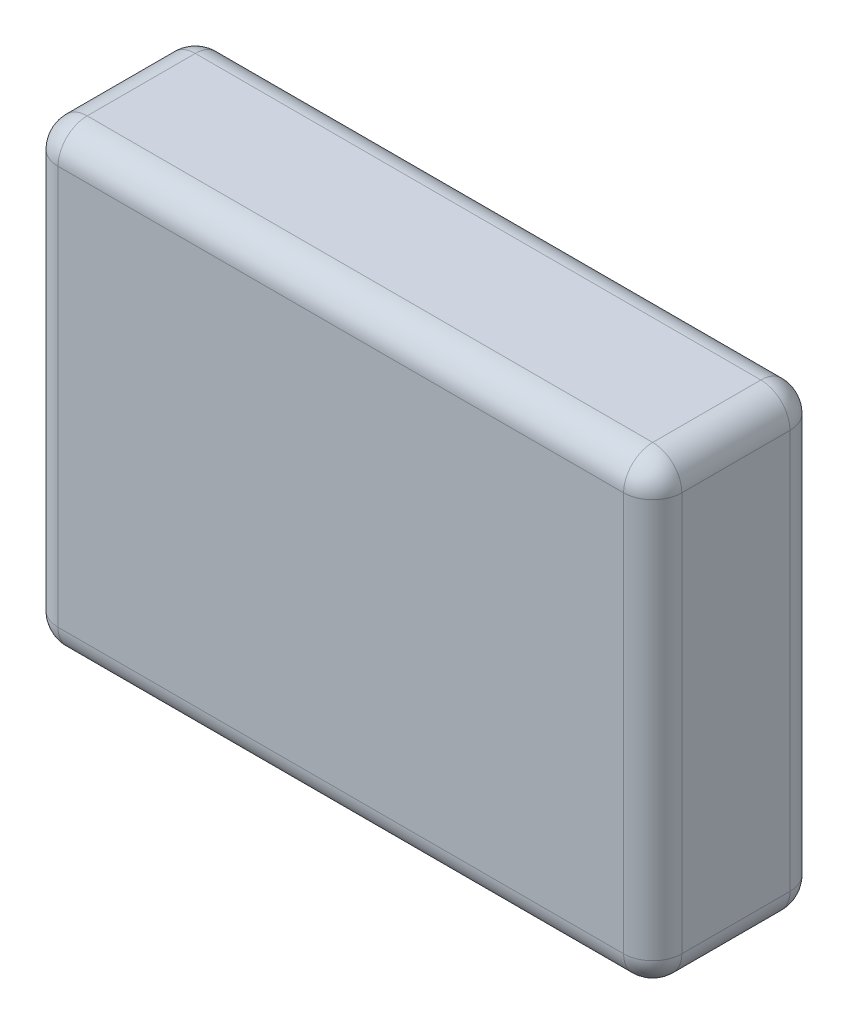
ISO-10303-21;
HEADER;
FILE_DESCRIPTION(('STEP AP214'),'2;1');
FILE_NAME('part.step','',(''),(''),'','','');
FILE_SCHEMA(('AUTOMOTIVE_DESIGN { 1 0 10303 214 1 1 1 1 }'));
ENDSEC;
DATA;
#1=APPLICATION_CONTEXT('core data for automotive mechanical design processes');
#2=APPLICATION_PROTOCOL_DEFINITION('international standard','automotive_design',2000,#1);
#3=PRODUCT_CONTEXT('',#1,'mechanical');
#4=PRODUCT('Part','Part','',(#3));
#5=PRODUCT_RELATED_PRODUCT_CATEGORY('part','',(#4));
#6=PRODUCT_DEFINITION_FORMATION('','',#4);
#7=PRODUCT_DEFINITION_CONTEXT('part definition',#1,'design');
#8=PRODUCT_DEFINITION('design','',#6,#7);
#9=PRODUCT_DEFINITION_SHAPE('','',#8);
#10=(LENGTH_UNIT() NAMED_UNIT(*) SI_UNIT(.MILLI.,.METRE.));
#11=(NAMED_UNIT(*) PLANE_ANGLE_UNIT() SI_UNIT($,.RADIAN.));
#12=(NAMED_UNIT(*) SI_UNIT($,.STERADIAN.) SOLID_ANGLE_UNIT());
#13=UNCERTAINTY_MEASURE_WITH_UNIT(LENGTH_MEASURE(1.E-05),#10,'distance_accuracy_value','');
#14=(GEOMETRIC_REPRESENTATION_CONTEXT(3) GLOBAL_UNCERTAINTY_ASSIGNED_CONTEXT((#13)) GLOBAL_UNIT_ASSIGNED_CONTEXT((#10,
#11,#12)) REPRESENTATION_CONTEXT('',''));
#15=CARTESIAN_POINT('',(0.,0.,0.));
#16=DIRECTION('',(0.,0.,1.));
#17=DIRECTION('',(1.,0.,0.));
#18=AXIS2_PLACEMENT_3D('',#15,#16,#17);
#19=CARTESIAN_POINT('',(0.,0.,200.));
#20=DIRECTION('',(1.,0.,0.));
#21=DIRECTION('',(0.,1.,0.));
#22=AXIS2_PLACEMENT_3D('',#19,#20,#21);
#23=PLANE('',#22);
#24=DIRECTION('',(0.,0.,-1.));
#25=VECTOR('',#24,1.);
#26=CARTESIAN_POINT('',(0.,35.,200.));
#27=LINE('',#26,#25);
#28=CARTESIAN_POINT('',(0.,35.,35.));
#29=VERTEX_POINT('',#28);
#30=CARTESIAN_POINT('',(0.,35.,165.));
#31=VERTEX_POINT('',#30);
#32=EDGE_CURVE('E131',#29,#31,#27,.F.);
#33=ORIENTED_EDGE('',*,*,#32,.T.);
#34=DIRECTION('',(0.,-1.,0.));
#35=VECTOR('',#34,1.);
#36=CARTESIAN_POINT('',(0.,0.,165.));
#37=LINE('',#36,#35);
#38=CARTESIAN_POINT('',(-2.07914493702529E-13,515.,165.));
#39=VERTEX_POINT('',#38);
#40=EDGE_CURVE('E168',#31,#39,#37,.F.);
#41=ORIENTED_EDGE('',*,*,#40,.T.);
#42=DIRECTION('',(0.,0.,-1.));
#43=VECTOR('',#42,1.);
#44=CARTESIAN_POINT('',(-2.07914493702529E-13,515.,200.));
#45=LINE('',#44,#43);
#46=CARTESIAN_POINT('',(-2.07914493702529E-13,515.,35.));
#47=VERTEX_POINT('',#46);
#48=EDGE_CURVE('E165',#39,#47,#45,.T.);
#49=ORIENTED_EDGE('',*,*,#48,.T.);
#50=DIRECTION('',(0.,-1.,0.));
#51=VECTOR('',#50,1.);
#52=CARTESIAN_POINT('',(0.,0.,35.));
#53=LINE('',#52,#51);
#54=EDGE_CURVE('E160',#47,#29,#53,.T.);
#55=ORIENTED_EDGE('',*,*,#54,.T.);
#56=EDGE_LOOP('',(#33,#41,#49,#55));
#57=FACE_BOUND('',#56,.T.);
#58=ADVANCED_FACE('F35',(#57),#23,.F.);
#59=CARTESIAN_POINT('',(0.,0.,200.));
#60=DIRECTION('',(0.,1.,0.));
#61=DIRECTION('',(0.,0.,1.));
#62=AXIS2_PLACEMENT_3D('',#59,#60,#61);
#63=PLANE('',#62);
#64=DIRECTION('',(0.,0.,-1.));
#65=VECTOR('',#64,1.);
#66=CARTESIAN_POINT('',(715.,0.,200.));
#67=LINE('',#66,#65);
#68=CARTESIAN_POINT('',(715.,0.,35.));
#69=VERTEX_POINT('',#68);
#70=CARTESIAN_POINT('',(715.,0.,165.));
#71=VERTEX_POINT('',#70);
#72=EDGE_CURVE('E153',#69,#71,#67,.F.);
#73=ORIENTED_EDGE('',*,*,#72,.T.);
#74=DIRECTION('',(1.,0.,0.));
#75=VECTOR('',#74,1.);
#76=CARTESIAN_POINT('',(0.,0.,165.));
#77=LINE('',#76,#75);
#78=CARTESIAN_POINT('',(35.,0.,165.));
#79=VERTEX_POINT('',#78);
#80=EDGE_CURVE('E157',#71,#79,#77,.F.);
#81=ORIENTED_EDGE('',*,*,#80,.T.);
#82=DIRECTION('',(0.,0.,-1.));
#83=VECTOR('',#82,1.);
#84=CARTESIAN_POINT('',(35.,0.,200.));
#85=LINE('',#84,#83);
#86=CARTESIAN_POINT('',(35.,0.,35.));
#87=VERTEX_POINT('',#86);
#88=EDGE_CURVE('E129',#79,#87,#85,.T.);
#89=ORIENTED_EDGE('',*,*,#88,.T.);
#90=DIRECTION('',(1.,0.,0.));
#91=VECTOR('',#90,1.);
#92=CARTESIAN_POINT('',(750.,0.,35.));
#93=LINE('',#92,#91);
#94=EDGE_CURVE('E147',#87,#69,#93,.T.);
#95=ORIENTED_EDGE('',*,*,#94,.T.);
#96=EDGE_LOOP('',(#73,#81,#89,#95));
#97=FACE_BOUND('',#96,.T.);
#98=ADVANCED_FACE('F155',(#97),#63,.F.);
#99=CARTESIAN_POINT('',(750.,0.,200.));
#100=DIRECTION('',(-1.,0.,0.));
#101=DIRECTION('',(0.,-1.,0.));
#102=AXIS2_PLACEMENT_3D('',#99,#100,#101);
#103=PLANE('',#102);
#104=DIRECTION('',(0.,0.,-1.));
#105=VECTOR('',#104,1.);
#106=CARTESIAN_POINT('',(750.,515.,200.));
#107=LINE('',#106,#105);
#108=CARTESIAN_POINT('',(750.,515.,35.));
#109=VERTEX_POINT('',#108);
#110=CARTESIAN_POINT('',(750.,515.,165.));
#111=VERTEX_POINT('',#110);
#112=EDGE_CURVE('E172',#109,#111,#107,.F.);
#113=ORIENTED_EDGE('',*,*,#112,.T.);
#114=DIRECTION('',(0.,1.,0.));
#115=VECTOR('',#114,1.);
#116=CARTESIAN_POINT('',(750.,0.,165.));
#117=LINE('',#116,#115);
#118=CARTESIAN_POINT('',(750.,35.,165.));
#119=VERTEX_POINT('',#118);
#120=EDGE_CURVE('E177',#111,#119,#117,.F.);
#121=ORIENTED_EDGE('',*,*,#120,.T.);
#122=DIRECTION('',(0.,0.,-1.));
#123=VECTOR('',#122,1.);
#124=CARTESIAN_POINT('',(750.,35.,200.));
#125=LINE('',#124,#123);
#126=CARTESIAN_POINT('',(750.,35.,35.));
#127=VERTEX_POINT('',#126);
#128=EDGE_CURVE('E174',#119,#127,#125,.T.);
#129=ORIENTED_EDGE('',*,*,#128,.T.);
#130=DIRECTION('',(0.,1.,0.));
#131=VECTOR('',#130,1.);
#132=CARTESIAN_POINT('',(750.,550.,35.));
#133=LINE('',#132,#131);
#134=EDGE_CURVE('E170',#127,#109,#133,.T.);
#135=ORIENTED_EDGE('',*,*,#134,.T.);
#136=EDGE_LOOP('',(#113,#121,#129,#135));
#137=FACE_BOUND('',#136,.T.);
#138=ADVANCED_FACE('F282',(#137),#103,.F.);
#139=CARTESIAN_POINT('',(-2.22044604925031E-13,550.,200.));
#140=DIRECTION('',(0.,-1.,0.));
#141=DIRECTION('',(0.,0.,-1.));
#142=AXIS2_PLACEMENT_3D('',#139,#140,#141);
#143=PLANE('',#142);
#144=DIRECTION('',(0.,0.,-1.));
#145=VECTOR('',#144,1.);
#146=CARTESIAN_POINT('',(34.9999999999998,550.,200.));
#147=LINE('',#146,#145);
#148=CARTESIAN_POINT('',(34.9999999999998,550.,35.));
#149=VERTEX_POINT('',#148);
#150=CARTESIAN_POINT('',(34.9999999999998,550.,165.));
#151=VERTEX_POINT('',#150);
#152=EDGE_CURVE('E181',#149,#151,#147,.F.);
#153=ORIENTED_EDGE('',*,*,#152,.T.);
#154=DIRECTION('',(-1.,0.,0.));
#155=VECTOR('',#154,1.);
#156=CARTESIAN_POINT('',(-2.22044604925031E-13,550.,165.));
#157=LINE('',#156,#155);
#158=CARTESIAN_POINT('',(715.,550.,165.));
#159=VERTEX_POINT('',#158);
#160=EDGE_CURVE('E186',#151,#159,#157,.F.);
#161=ORIENTED_EDGE('',*,*,#160,.T.);
#162=DIRECTION('',(0.,0.,-1.));
#163=VECTOR('',#162,1.);
#164=CARTESIAN_POINT('',(715.,550.,200.));
#165=LINE('',#164,#163);
#166=CARTESIAN_POINT('',(715.,550.,35.));
#167=VERTEX_POINT('',#166);
#168=EDGE_CURVE('E183',#159,#167,#165,.T.);
#169=ORIENTED_EDGE('',*,*,#168,.T.);
#170=DIRECTION('',(-1.,0.,0.));
#171=VECTOR('',#170,1.);
#172=CARTESIAN_POINT('',(-2.22044604925031E-13,550.,35.));
#173=LINE('',#172,#171);
#174=EDGE_CURVE('E179',#167,#149,#173,.T.);
#175=ORIENTED_EDGE('',*,*,#174,.T.);
#176=EDGE_LOOP('',(#153,#161,#169,#175));
#177=FACE_BOUND('',#176,.T.);
#178=ADVANCED_FACE('F293',(#177),#143,.F.);
#179=CARTESIAN_POINT('',(0.,0.,200.));
#180=DIRECTION('',(0.,0.,-1.));
#181=DIRECTION('',(-1.,0.,0.));
#182=AXIS2_PLACEMENT_3D('',#179,#180,#181);
#183=PLANE('',#182);
#184=DIRECTION('',(0.,1.,0.));
#185=VECTOR('',#184,1.);
#186=CARTESIAN_POINT('',(715.,2.88657986402541E-13,200.));
#187=LINE('',#186,#185);
#188=CARTESIAN_POINT('',(715.,35.,200.));
#189=VERTEX_POINT('',#188);
#190=CARTESIAN_POINT('',(715.,515.,200.));
#191=VERTEX_POINT('',#190);
#192=EDGE_CURVE('E192',#189,#191,#187,.T.);
#193=ORIENTED_EDGE('',*,*,#192,.T.);
#194=DIRECTION('',(-1.,0.,0.));
#195=VECTOR('',#194,1.);
#196=CARTESIAN_POINT('',(0.,515.,200.));
#197=LINE('',#196,#195);
#198=CARTESIAN_POINT('',(34.9999999999998,515.,200.));
#199=VERTEX_POINT('',#198);
#200=EDGE_CURVE('E194',#191,#199,#197,.T.);
#201=ORIENTED_EDGE('',*,*,#200,.T.);
#202=DIRECTION('',(0.,-1.,0.));
#203=VECTOR('',#202,1.);
#204=CARTESIAN_POINT('',(35.,0.,200.));
#205=LINE('',#204,#203);
#206=CARTESIAN_POINT('',(35.,35.,200.));
#207=VERTEX_POINT('',#206);
#208=EDGE_CURVE('E188',#199,#207,#205,.T.);
#209=ORIENTED_EDGE('',*,*,#208,.T.);
#210=DIRECTION('',(1.,0.,0.));
#211=VECTOR('',#210,1.);
#212=CARTESIAN_POINT('',(0.,35.,200.));
#213=LINE('',#212,#211);
#214=EDGE_CURVE('E190',#207,#189,#213,.T.);
#215=ORIENTED_EDGE('',*,*,#214,.T.);
#216=EDGE_LOOP('',(#193,#201,#209,#215));
#217=FACE_BOUND('',#216,.T.);
#218=ADVANCED_FACE('F274',(#217),#183,.F.);
#219=CARTESIAN_POINT('',(0.,0.,0.));
#220=DIRECTION('',(0.,0.,-1.));
#221=DIRECTION('',(-1.,0.,0.));
#222=AXIS2_PLACEMENT_3D('',#219,#220,#221);
#223=PLANE('',#222);
#224=DIRECTION('',(0.,1.,0.));
#225=VECTOR('',#224,1.);
#226=CARTESIAN_POINT('',(715.,0.,0.));
#227=LINE('',#226,#225);
#228=CARTESIAN_POINT('',(715.,515.,0.));
#229=VERTEX_POINT('',#228);
#230=CARTESIAN_POINT('',(715.,35.,0.));
#231=VERTEX_POINT('',#230);
#232=EDGE_CURVE('E44',#229,#231,#227,.F.);
#233=ORIENTED_EDGE('',*,*,#232,.T.);
#234=DIRECTION('',(1.,0.,0.));
#235=VECTOR('',#234,1.);
#236=CARTESIAN_POINT('',(0.,35.,0.));
#237=LINE('',#236,#235);
#238=CARTESIAN_POINT('',(35.,35.,0.));
#239=VERTEX_POINT('',#238);
#240=EDGE_CURVE('E11',#231,#239,#237,.F.);
#241=ORIENTED_EDGE('',*,*,#240,.T.);
#242=DIRECTION('',(0.,-1.,0.));
#243=VECTOR('',#242,1.);
#244=CARTESIAN_POINT('',(34.9999999999998,550.,0.));
#245=LINE('',#244,#243);
#246=CARTESIAN_POINT('',(34.9999999999998,515.,0.));
#247=VERTEX_POINT('',#246);
#248=EDGE_CURVE('E197',#239,#247,#245,.F.);
#249=ORIENTED_EDGE('',*,*,#248,.T.);
#250=DIRECTION('',(-1.,0.,0.));
#251=VECTOR('',#250,1.);
#252=CARTESIAN_POINT('',(750.,515.,0.));
#253=LINE('',#252,#251);
#254=EDGE_CURVE('E55',#247,#229,#253,.F.);
#255=ORIENTED_EDGE('',*,*,#254,.T.);
#256=EDGE_LOOP('',(#233,#241,#249,#255));
#257=FACE_BOUND('',#256,.T.);
#258=ADVANCED_FACE('F480',(#257),#223,.T.);
#259=CARTESIAN_POINT('',(715.,515.,200.));
#260=DIRECTION('',(0.,0.,-1.));
#261=DIRECTION('',(-1.,0.,0.));
#262=AXIS2_PLACEMENT_3D('',#259,#260,#261);
#263=CYLINDRICAL_SURFACE('',#262,35.);
#264=CARTESIAN_POINT('',(715.,515.,165.));
#265=DIRECTION('',(0.,0.,1.));
#266=DIRECTION('',(1.,0.,0.));
#267=AXIS2_PLACEMENT_3D('',#264,#265,#266);
#268=CIRCLE('',#267,35.);
#269=EDGE_CURVE('E39',#111,#159,#268,.T.);
#270=ORIENTED_EDGE('',*,*,#269,.F.);
#271=ORIENTED_EDGE('',*,*,#112,.F.);
#272=CARTESIAN_POINT('',(715.,515.,35.));
#273=DIRECTION('',(0.,0.,-1.));
#274=DIRECTION('',(-1.,0.,0.));
#275=AXIS2_PLACEMENT_3D('',#272,#273,#274);
#276=CIRCLE('',#275,35.);
#277=EDGE_CURVE('E251',#167,#109,#276,.T.);
#278=ORIENTED_EDGE('',*,*,#277,.F.);
#279=ORIENTED_EDGE('',*,*,#168,.F.);
#280=EDGE_LOOP('',(#270,#271,#278,#279));
#281=FACE_BOUND('',#280,.T.);
#282=ADVANCED_FACE('F37',(#281),#263,.T.);
#283=CARTESIAN_POINT('',(715.,515.,165.));
#284=DIRECTION('',(0.,0.,1.));
#285=DIRECTION('',(1.,0.,0.));
#286=AXIS2_PLACEMENT_3D('',#283,#284,#285);
#287=SPHERICAL_SURFACE('',#286,35.);
#288=CARTESIAN_POINT('',(715.,515.,165.));
#289=DIRECTION('',(0.,1.,0.));
#290=DIRECTION('',(0.,0.,1.));
#291=AXIS2_PLACEMENT_3D('',#288,#289,#290);
#292=CIRCLE('',#291,35.);
#293=EDGE_CURVE('E246',#111,#191,#292,.F.);
#294=ORIENTED_EDGE('',*,*,#293,.F.);
#295=ORIENTED_EDGE('',*,*,#269,.T.);
#296=CARTESIAN_POINT('',(715.,515.,165.));
#297=DIRECTION('',(1.,0.,0.));
#298=DIRECTION('',(0.,0.,-1.));
#299=AXIS2_PLACEMENT_3D('',#296,#297,#298);
#300=CIRCLE('',#299,35.);
#301=EDGE_CURVE('E249',#191,#159,#300,.F.);
#302=ORIENTED_EDGE('',*,*,#301,.F.);
#303=EDGE_LOOP('',(#294,#295,#302));
#304=FACE_BOUND('',#303,.T.);
#305=ADVANCED_FACE('F262',(#304),#287,.T.);
#306=CARTESIAN_POINT('',(715.,515.,35.));
#307=DIRECTION('',(0.,0.,1.));
#308=DIRECTION('',(1.,0.,0.));
#309=AXIS2_PLACEMENT_3D('',#306,#307,#308);
#310=SPHERICAL_SURFACE('',#309,35.);
#311=CARTESIAN_POINT('',(715.,515.,35.));
#312=DIRECTION('',(1.,0.,0.));
#313=DIRECTION('',(0.,0.,-1.));
#314=AXIS2_PLACEMENT_3D('',#311,#312,#313);
#315=CIRCLE('',#314,35.);
#316=EDGE_CURVE('E241',#167,#229,#315,.F.);
#317=ORIENTED_EDGE('',*,*,#316,.F.);
#318=ORIENTED_EDGE('',*,*,#277,.T.);
#319=CARTESIAN_POINT('',(715.,515.,35.));
#320=DIRECTION('',(0.,1.,0.));
#321=DIRECTION('',(0.,0.,1.));
#322=AXIS2_PLACEMENT_3D('',#319,#320,#321);
#323=CIRCLE('',#322,35.);
#324=EDGE_CURVE('E243',#229,#109,#323,.F.);
#325=ORIENTED_EDGE('',*,*,#324,.F.);
#326=EDGE_LOOP('',(#317,#318,#325));
#327=FACE_BOUND('',#326,.T.);
#328=ADVANCED_FACE('F459',(#327),#310,.T.);
#329=CARTESIAN_POINT('',(0.,515.,165.));
#330=DIRECTION('',(-1.,0.,0.));
#331=DIRECTION('',(0.,0.,1.));
#332=AXIS2_PLACEMENT_3D('',#329,#330,#331);
#333=CYLINDRICAL_SURFACE('',#332,35.);
#334=ORIENTED_EDGE('',*,*,#301,.T.);
#335=ORIENTED_EDGE('',*,*,#160,.F.);
#336=CARTESIAN_POINT('',(34.9999999999998,515.,165.));
#337=DIRECTION('',(-1.,0.,0.));
#338=DIRECTION('',(0.,0.,1.));
#339=AXIS2_PLACEMENT_3D('',#336,#337,#338);
#340=CIRCLE('',#339,35.);
#341=EDGE_CURVE('E235',#199,#151,#340,.T.);
#342=ORIENTED_EDGE('',*,*,#341,.F.);
#343=ORIENTED_EDGE('',*,*,#200,.F.);
#344=EDGE_LOOP('',(#334,#335,#342,#343));
#345=FACE_BOUND('',#344,.T.);
#346=ADVANCED_FACE('F270',(#345),#333,.T.);
#347=CARTESIAN_POINT('',(715.,2.88657986402541E-13,165.));
#348=DIRECTION('',(0.,1.,0.));
#349=DIRECTION('',(-1.,0.,0.));
#350=AXIS2_PLACEMENT_3D('',#347,#348,#349);
#351=CYLINDRICAL_SURFACE('',#350,35.);
#352=ORIENTED_EDGE('',*,*,#293,.T.);
#353=ORIENTED_EDGE('',*,*,#192,.F.);
#354=CARTESIAN_POINT('',(715.,35.,165.));
#355=DIRECTION('',(0.,-1.,0.));
#356=DIRECTION('',(1.,0.,0.));
#357=AXIS2_PLACEMENT_3D('',#354,#355,#356);
#358=CIRCLE('',#357,35.);
#359=EDGE_CURVE('E232',#119,#189,#358,.T.);
#360=ORIENTED_EDGE('',*,*,#359,.F.);
#361=ORIENTED_EDGE('',*,*,#120,.F.);
#362=EDGE_LOOP('',(#352,#353,#360,#361));
#363=FACE_BOUND('',#362,.T.);
#364=ADVANCED_FACE('F279',(#363),#351,.T.);
#365=CARTESIAN_POINT('',(715.,35.,200.));
#366=DIRECTION('',(0.,0.,-1.));
#367=DIRECTION('',(-1.,0.,0.));
#368=AXIS2_PLACEMENT_3D('',#365,#366,#367);
#369=CYLINDRICAL_SURFACE('',#368,35.);
#370=CARTESIAN_POINT('',(715.,35.,35.));
#371=DIRECTION('',(0.,0.,-1.));
#372=DIRECTION('',(-1.,0.,0.));
#373=AXIS2_PLACEMENT_3D('',#370,#371,#372);
#374=CIRCLE('',#373,35.);
#375=EDGE_CURVE('E226',#127,#69,#374,.T.);
#376=ORIENTED_EDGE('',*,*,#375,.F.);
#377=ORIENTED_EDGE('',*,*,#128,.F.);
#378=CARTESIAN_POINT('',(715.,35.,165.));
#379=DIRECTION('',(0.,0.,1.));
#380=DIRECTION('',(1.,0.,0.));
#381=AXIS2_PLACEMENT_3D('',#378,#379,#380);
#382=CIRCLE('',#381,35.);
#383=EDGE_CURVE('E229',#71,#119,#382,.T.);
#384=ORIENTED_EDGE('',*,*,#383,.F.);
#385=ORIENTED_EDGE('',*,*,#72,.F.);
#386=EDGE_LOOP('',(#376,#377,#384,#385));
#387=FACE_BOUND('',#386,.T.);
#388=ADVANCED_FACE('F286',(#387),#369,.T.);
#389=CARTESIAN_POINT('',(715.,0.,35.));
#390=DIRECTION('',(0.,-1.,0.));
#391=DIRECTION('',(1.,0.,0.));
#392=AXIS2_PLACEMENT_3D('',#389,#390,#391);
#393=CYLINDRICAL_SURFACE('',#392,35.);
#394=ORIENTED_EDGE('',*,*,#324,.T.);
#395=ORIENTED_EDGE('',*,*,#134,.F.);
#396=CARTESIAN_POINT('',(715.,35.,35.));
#397=DIRECTION('',(0.,-1.,0.));
#398=DIRECTION('',(1.,0.,0.));
#399=AXIS2_PLACEMENT_3D('',#396,#397,#398);
#400=CIRCLE('',#399,35.);
#401=EDGE_CURVE('E224',#231,#127,#400,.T.);
#402=ORIENTED_EDGE('',*,*,#401,.F.);
#403=ORIENTED_EDGE('',*,*,#232,.F.);
#404=EDGE_LOOP('',(#394,#395,#402,#403));
#405=FACE_BOUND('',#404,.T.);
#406=ADVANCED_FACE('F291',(#405),#393,.T.);
#407=CARTESIAN_POINT('',(-2.22044604925031E-13,515.,35.));
#408=DIRECTION('',(1.,0.,0.));
#409=DIRECTION('',(0.,0.,-1.));
#410=AXIS2_PLACEMENT_3D('',#407,#408,#409);
#411=CYLINDRICAL_SURFACE('',#410,35.);
#412=ORIENTED_EDGE('',*,*,#316,.T.);
#413=ORIENTED_EDGE('',*,*,#254,.F.);
#414=CARTESIAN_POINT('',(34.9999999999998,515.,35.));
#415=DIRECTION('',(-1.,0.,0.));
#416=DIRECTION('',(0.,0.,1.));
#417=AXIS2_PLACEMENT_3D('',#414,#415,#416);
#418=CIRCLE('',#417,35.);
#419=EDGE_CURVE('E221',#149,#247,#418,.T.);
#420=ORIENTED_EDGE('',*,*,#419,.F.);
#421=ORIENTED_EDGE('',*,*,#174,.F.);
#422=EDGE_LOOP('',(#412,#413,#420,#421));
#423=FACE_BOUND('',#422,.T.);
#424=ADVANCED_FACE('F302',(#423),#411,.T.);
#425=CARTESIAN_POINT('',(34.9999999999998,515.,200.));
#426=DIRECTION('',(0.,0.,-1.));
#427=DIRECTION('',(-1.,0.,0.));
#428=AXIS2_PLACEMENT_3D('',#425,#426,#427);
#429=CYLINDRICAL_SURFACE('',#428,35.);
#430=CARTESIAN_POINT('',(34.9999999999998,515.,165.));
#431=DIRECTION('',(0.,0.,1.));
#432=DIRECTION('',(1.,0.,0.));
#433=AXIS2_PLACEMENT_3D('',#430,#431,#432);
#434=CIRCLE('',#433,35.);
#435=EDGE_CURVE('E238',#151,#39,#434,.T.);
#436=ORIENTED_EDGE('',*,*,#435,.F.);
#437=ORIENTED_EDGE('',*,*,#152,.F.);
#438=CARTESIAN_POINT('',(34.9999999999998,515.,35.));
#439=DIRECTION('',(0.,0.,-1.));
#440=DIRECTION('',(-1.,0.,0.));
#441=AXIS2_PLACEMENT_3D('',#438,#439,#440);
#442=CIRCLE('',#441,35.);
#443=EDGE_CURVE('E218',#47,#149,#442,.T.);
#444=ORIENTED_EDGE('',*,*,#443,.F.);
#445=ORIENTED_EDGE('',*,*,#48,.F.);
#446=EDGE_LOOP('',(#436,#437,#444,#445));
#447=FACE_BOUND('',#446,.T.);
#448=ADVANCED_FACE('F298',(#447),#429,.T.);
#449=CARTESIAN_POINT('',(34.9999999999998,515.,165.));
#450=DIRECTION('',(0.,0.,1.));
#451=DIRECTION('',(1.,0.,0.));
#452=AXIS2_PLACEMENT_3D('',#449,#450,#451);
#453=SPHERICAL_SURFACE('',#452,35.);
#454=ORIENTED_EDGE('',*,*,#341,.T.);
#455=ORIENTED_EDGE('',*,*,#435,.T.);
#456=CARTESIAN_POINT('',(34.9999999999998,515.,165.));
#457=DIRECTION('',(0.,1.,0.));
#458=DIRECTION('',(0.,0.,1.));
#459=AXIS2_PLACEMENT_3D('',#456,#457,#458);
#460=CIRCLE('',#459,35.);
#461=EDGE_CURVE('E215',#199,#39,#460,.F.);
#462=ORIENTED_EDGE('',*,*,#461,.F.);
#463=EDGE_LOOP('',(#454,#455,#462));
#464=FACE_BOUND('',#463,.T.);
#465=ADVANCED_FACE('F312',(#464),#453,.T.);
#466=CARTESIAN_POINT('',(715.,35.,165.));
#467=DIRECTION('',(0.,0.,1.));
#468=DIRECTION('',(1.,0.,0.));
#469=AXIS2_PLACEMENT_3D('',#466,#467,#468);
#470=SPHERICAL_SURFACE('',#469,35.);
#471=ORIENTED_EDGE('',*,*,#383,.T.);
#472=ORIENTED_EDGE('',*,*,#359,.T.);
#473=CARTESIAN_POINT('',(715.,35.,165.));
#474=DIRECTION('',(1.,0.,0.));
#475=DIRECTION('',(0.,0.,-1.));
#476=AXIS2_PLACEMENT_3D('',#473,#474,#475);
#477=CIRCLE('',#476,35.);
#478=EDGE_CURVE('E212',#71,#189,#477,.F.);
#479=ORIENTED_EDGE('',*,*,#478,.F.);
#480=EDGE_LOOP('',(#471,#472,#479));
#481=FACE_BOUND('',#480,.T.);
#482=ADVANCED_FACE('F322',(#481),#470,.T.);
#483=CARTESIAN_POINT('',(715.,35.,35.));
#484=DIRECTION('',(0.,0.,1.));
#485=DIRECTION('',(1.,0.,0.));
#486=AXIS2_PLACEMENT_3D('',#483,#484,#485);
#487=SPHERICAL_SURFACE('',#486,35.);
#488=ORIENTED_EDGE('',*,*,#401,.T.);
#489=ORIENTED_EDGE('',*,*,#375,.T.);
#490=CARTESIAN_POINT('',(715.,35.,35.));
#491=DIRECTION('',(1.,0.,0.));
#492=DIRECTION('',(0.,0.,-1.));
#493=AXIS2_PLACEMENT_3D('',#490,#491,#492);
#494=CIRCLE('',#493,35.);
#495=EDGE_CURVE('E150',#231,#69,#494,.F.);
#496=ORIENTED_EDGE('',*,*,#495,.F.);
#497=EDGE_LOOP('',(#488,#489,#496));
#498=FACE_BOUND('',#497,.T.);
#499=ADVANCED_FACE('F324',(#498),#487,.T.);
#500=CARTESIAN_POINT('',(34.9999999999998,515.,35.));
#501=DIRECTION('',(0.,0.,1.));
#502=DIRECTION('',(1.,0.,0.));
#503=AXIS2_PLACEMENT_3D('',#500,#501,#502);
#504=SPHERICAL_SURFACE('',#503,35.);
#505=ORIENTED_EDGE('',*,*,#443,.T.);
#506=ORIENTED_EDGE('',*,*,#419,.T.);
#507=CARTESIAN_POINT('',(34.9999999999998,515.,35.));
#508=DIRECTION('',(0.,1.,0.));
#509=DIRECTION('',(0.,0.,1.));
#510=AXIS2_PLACEMENT_3D('',#507,#508,#509);
#511=CIRCLE('',#510,35.);
#512=EDGE_CURVE('E208',#47,#247,#511,.F.);
#513=ORIENTED_EDGE('',*,*,#512,.F.);
#514=EDGE_LOOP('',(#505,#506,#513));
#515=FACE_BOUND('',#514,.T.);
#516=ADVANCED_FACE('F304',(#515),#504,.T.);
#517=CARTESIAN_POINT('',(35.,0.,165.));
#518=DIRECTION('',(0.,-1.,0.));
#519=DIRECTION('',(1.,0.,0.));
#520=AXIS2_PLACEMENT_3D('',#517,#518,#519);
#521=CYLINDRICAL_SURFACE('',#520,35.);
#522=ORIENTED_EDGE('',*,*,#461,.T.);
#523=ORIENTED_EDGE('',*,*,#40,.F.);
#524=CARTESIAN_POINT('',(35.,35.,165.));
#525=DIRECTION('',(0.,-1.,0.));
#526=DIRECTION('',(1.,0.,0.));
#527=AXIS2_PLACEMENT_3D('',#524,#525,#526);
#528=CIRCLE('',#527,35.);
#529=EDGE_CURVE('E205',#207,#31,#528,.T.);
#530=ORIENTED_EDGE('',*,*,#529,.F.);
#531=ORIENTED_EDGE('',*,*,#208,.F.);
#532=EDGE_LOOP('',(#522,#523,#530,#531));
#533=FACE_BOUND('',#532,.T.);
#534=ADVANCED_FACE('F314',(#533),#521,.T.);
#535=CARTESIAN_POINT('',(0.,35.,165.));
#536=DIRECTION('',(1.,0.,0.));
#537=DIRECTION('',(0.,0.,-1.));
#538=AXIS2_PLACEMENT_3D('',#535,#536,#537);
#539=CYLINDRICAL_SURFACE('',#538,35.);
#540=ORIENTED_EDGE('',*,*,#478,.T.);
#541=ORIENTED_EDGE('',*,*,#214,.F.);
#542=CARTESIAN_POINT('',(35.,35.,165.));
#543=DIRECTION('',(-1.,0.,0.));
#544=DIRECTION('',(0.,0.,1.));
#545=AXIS2_PLACEMENT_3D('',#542,#543,#544);
#546=CIRCLE('',#545,35.);
#547=EDGE_CURVE('E144',#79,#207,#546,.T.);
#548=ORIENTED_EDGE('',*,*,#547,.F.);
#549=ORIENTED_EDGE('',*,*,#80,.F.);
#550=EDGE_LOOP('',(#540,#541,#548,#549));
#551=FACE_BOUND('',#550,.T.);
#552=ADVANCED_FACE('F320',(#551),#539,.T.);
#553=CARTESIAN_POINT('',(0.,35.,35.));
#554=DIRECTION('',(-1.,0.,0.));
#555=DIRECTION('',(0.,0.,1.));
#556=AXIS2_PLACEMENT_3D('',#553,#554,#555);
#557=CYLINDRICAL_SURFACE('',#556,35.);
#558=ORIENTED_EDGE('',*,*,#495,.T.);
#559=ORIENTED_EDGE('',*,*,#94,.F.);
#560=CARTESIAN_POINT('',(35.,35.,35.));
#561=DIRECTION('',(-1.,0.,0.));
#562=DIRECTION('',(0.,0.,1.));
#563=AXIS2_PLACEMENT_3D('',#560,#561,#562);
#564=CIRCLE('',#563,35.);
#565=EDGE_CURVE('E136',#239,#87,#564,.T.);
#566=ORIENTED_EDGE('',*,*,#565,.F.);
#567=ORIENTED_EDGE('',*,*,#240,.F.);
#568=EDGE_LOOP('',(#558,#559,#566,#567));
#569=FACE_BOUND('',#568,.T.);
#570=ADVANCED_FACE('F148',(#569),#557,.T.);
#571=CARTESIAN_POINT('',(35.,0.,35.));
#572=DIRECTION('',(0.,1.,0.));
#573=DIRECTION('',(-1.,0.,0.));
#574=AXIS2_PLACEMENT_3D('',#571,#572,#573);
#575=CYLINDRICAL_SURFACE('',#574,35.);
#576=ORIENTED_EDGE('',*,*,#512,.T.);
#577=ORIENTED_EDGE('',*,*,#248,.F.);
#578=CARTESIAN_POINT('',(35.,35.,35.));
#579=DIRECTION('',(0.,-1.,0.));
#580=DIRECTION('',(1.,0.,0.));
#581=AXIS2_PLACEMENT_3D('',#578,#579,#580);
#582=CIRCLE('',#581,35.);
#583=EDGE_CURVE('E140',#29,#239,#582,.T.);
#584=ORIENTED_EDGE('',*,*,#583,.F.);
#585=ORIENTED_EDGE('',*,*,#54,.F.);
#586=EDGE_LOOP('',(#576,#577,#584,#585));
#587=FACE_BOUND('',#586,.T.);
#588=ADVANCED_FACE('F307',(#587),#575,.T.);
#589=CARTESIAN_POINT('',(35.,35.,165.));
#590=DIRECTION('',(0.,0.,1.));
#591=DIRECTION('',(1.,0.,0.));
#592=AXIS2_PLACEMENT_3D('',#589,#590,#591);
#593=SPHERICAL_SURFACE('',#592,35.);
#594=ORIENTED_EDGE('',*,*,#547,.T.);
#595=ORIENTED_EDGE('',*,*,#529,.T.);
#596=CARTESIAN_POINT('',(35.,35.,165.));
#597=DIRECTION('',(0.,0.,1.));
#598=DIRECTION('',(1.,0.,0.));
#599=AXIS2_PLACEMENT_3D('',#596,#597,#598);
#600=CIRCLE('',#599,35.);
#601=EDGE_CURVE('E133',#79,#31,#600,.F.);
#602=ORIENTED_EDGE('',*,*,#601,.F.);
#603=EDGE_LOOP('',(#594,#595,#602));
#604=FACE_BOUND('',#603,.T.);
#605=ADVANCED_FACE('F318',(#604),#593,.T.);
#606=CARTESIAN_POINT('',(35.,35.,35.));
#607=DIRECTION('',(0.,0.,1.));
#608=DIRECTION('',(1.,0.,0.));
#609=AXIS2_PLACEMENT_3D('',#606,#607,#608);
#610=SPHERICAL_SURFACE('',#609,35.);
#611=ORIENTED_EDGE('',*,*,#583,.T.);
#612=ORIENTED_EDGE('',*,*,#565,.T.);
#613=CARTESIAN_POINT('',(35.,35.,35.));
#614=DIRECTION('',(0.,0.,-1.));
#615=DIRECTION('',(-1.,0.,0.));
#616=AXIS2_PLACEMENT_3D('',#613,#614,#615);
#617=CIRCLE('',#616,35.);
#618=EDGE_CURVE('E125',#29,#87,#617,.F.);
#619=ORIENTED_EDGE('',*,*,#618,.F.);
#620=EDGE_LOOP('',(#611,#612,#619));
#621=FACE_BOUND('',#620,.T.);
#622=ADVANCED_FACE('F138',(#621),#610,.T.);
#623=CARTESIAN_POINT('',(35.,35.,200.));
#624=DIRECTION('',(0.,0.,-1.));
#625=DIRECTION('',(-1.,0.,0.));
#626=AXIS2_PLACEMENT_3D('',#623,#624,#625);
#627=CYLINDRICAL_SURFACE('',#626,35.);
#628=ORIENTED_EDGE('',*,*,#601,.T.);
#629=ORIENTED_EDGE('',*,*,#32,.F.);
#630=ORIENTED_EDGE('',*,*,#618,.T.);
#631=ORIENTED_EDGE('',*,*,#88,.F.);
#632=EDGE_LOOP('',(#628,#629,#630,#631));
#633=FACE_BOUND('',#632,.T.);
#634=ADVANCED_FACE('F127',(#633),#627,.T.);
#635=CLOSED_SHELL('',(#58,#98,#138,#178,#218,#258,#282,#305,#328,#346,#364,#388,#406,#424,#448,
#465,#482,#499,#516,#534,#552,#570,#588,#605,#622,#634));
#636=MANIFOLD_SOLID_BREP('B2',#635);
#637=ADVANCED_BREP_SHAPE_REPRESENTATION('',(#18,#636),#14);
#638=SHAPE_DEFINITION_REPRESENTATION(#9,#637);
ENDSEC;
END-ISO-10303-21;
